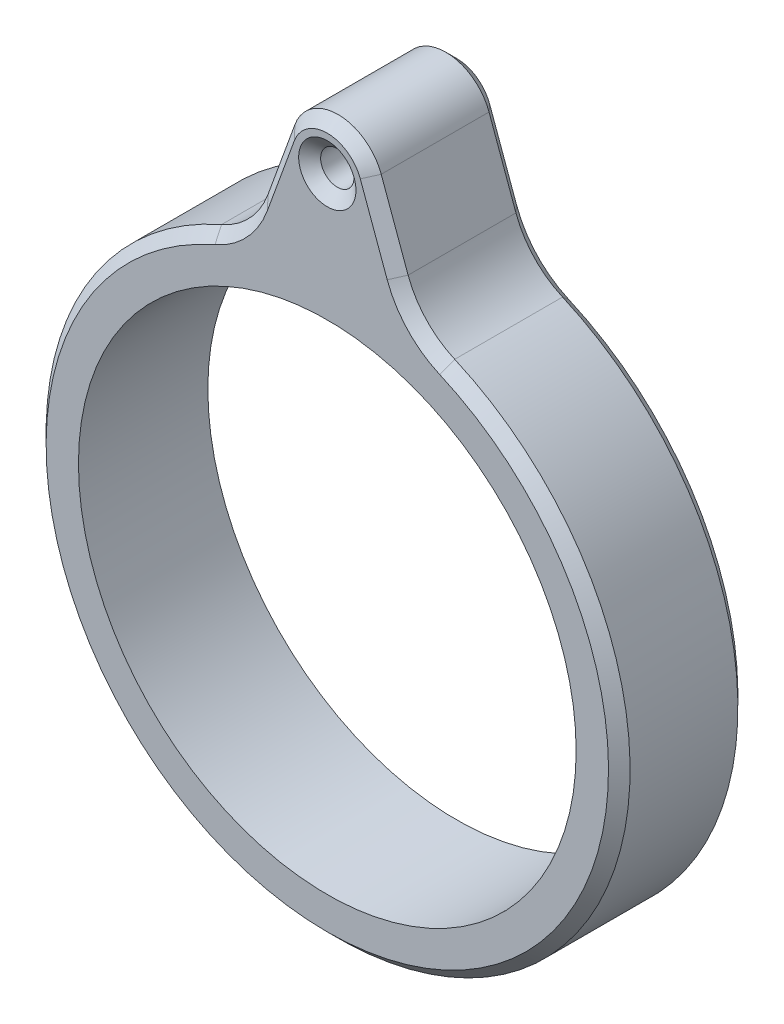
ISO-10303-21;
HEADER;
FILE_DESCRIPTION(('STEP AP214'),'2;1');
FILE_NAME('part.step','',(''),(''),'','','');
FILE_SCHEMA(('AUTOMOTIVE_DESIGN { 1 0 10303 214 1 1 1 1 }'));
ENDSEC;
DATA;
#1=APPLICATION_CONTEXT('core data for automotive mechanical design processes');
#2=APPLICATION_PROTOCOL_DEFINITION('international standard','automotive_design',2000,#1);
#3=PRODUCT_CONTEXT('',#1,'mechanical');
#4=PRODUCT('Part','Part','',(#3));
#5=PRODUCT_RELATED_PRODUCT_CATEGORY('part','',(#4));
#6=PRODUCT_DEFINITION_FORMATION('','',#4);
#7=PRODUCT_DEFINITION_CONTEXT('part definition',#1,'design');
#8=PRODUCT_DEFINITION('design','',#6,#7);
#9=PRODUCT_DEFINITION_SHAPE('','',#8);
#10=(LENGTH_UNIT() NAMED_UNIT(*) SI_UNIT(.MILLI.,.METRE.));
#11=(NAMED_UNIT(*) PLANE_ANGLE_UNIT() SI_UNIT($,.RADIAN.));
#12=(NAMED_UNIT(*) SI_UNIT($,.STERADIAN.) SOLID_ANGLE_UNIT());
#13=UNCERTAINTY_MEASURE_WITH_UNIT(LENGTH_MEASURE(1.E-05),#10,'distance_accuracy_value','');
#14=(GEOMETRIC_REPRESENTATION_CONTEXT(3) GLOBAL_UNCERTAINTY_ASSIGNED_CONTEXT((#13)) GLOBAL_UNIT_ASSIGNED_CONTEXT((#10,
#11,#12)) REPRESENTATION_CONTEXT('',''));
#15=CARTESIAN_POINT('',(0.,0.,0.));
#16=DIRECTION('',(0.,0.,1.));
#17=DIRECTION('',(1.,0.,0.));
#18=AXIS2_PLACEMENT_3D('',#15,#16,#17);
#19=CARTESIAN_POINT('',(0.,0.,19.05));
#20=DIRECTION('',(0.,0.,1.));
#21=DIRECTION('',(1.,0.,0.));
#22=AXIS2_PLACEMENT_3D('',#19,#20,#21);
#23=PLANE('',#22);
#24=CARTESIAN_POINT('',(0.,55.281971144778,19.05));
#25=DIRECTION('',(0.,0.,1.));
#26=DIRECTION('',(1.,0.,0.));
#27=AXIS2_PLACEMENT_3D('',#24,#25,#26);
#28=CIRCLE('',#27,4.2164);
#29=CARTESIAN_POINT('',(4.2164,55.281971144778,19.05));
#30=VERTEX_POINT('',#29);
#31=EDGE_CURVE('E542',#30,#30,#28,.T.);
#32=ORIENTED_EDGE('',*,*,#31,.F.);
#33=EDGE_LOOP('',(#32));
#34=FACE_BOUND('',#33,.T.);
#35=DIRECTION('',(-0.342020143325663,0.939692620785911,0.));
#36=VECTOR('',#35,1.);
#37=CARTESIAN_POINT('',(22.6255210099582,8.2350161823892,19.05));
#38=LINE('',#37,#36);
#39=CARTESIAN_POINT('',(8.81942001328237,46.1669669214668,19.05));
#40=VERTEX_POINT('',#39);
#41=CARTESIAN_POINT('',(4.85823796450243,57.0502251548388,19.05));
#42=VERTEX_POINT('',#41);
#43=EDGE_CURVE('E60',#40,#42,#38,.T.);
#44=ORIENTED_EDGE('',*,*,#43,.T.);
#45=CARTESIAN_POINT('',(0.,55.281971144778,19.05));
#46=DIRECTION('',(0.,0.,1.));
#47=DIRECTION('',(1.,0.,0.));
#48=AXIS2_PLACEMENT_3D('',#45,#46,#47);
#49=CIRCLE('',#48,5.1700288552221);
#50=CARTESIAN_POINT('',(-4.85823796450243,57.0502251548388,19.05));
#51=VERTEX_POINT('',#50);
#52=EDGE_CURVE('E11',#42,#51,#49,.T.);
#53=ORIENTED_EDGE('',*,*,#52,.T.);
#54=DIRECTION('',(-0.342020143325663,-0.939692620785911,0.));
#55=VECTOR('',#54,1.);
#56=CARTESIAN_POINT('',(-22.6255210099582,8.23501618238917,19.05));
#57=LINE('',#56,#55);
#58=CARTESIAN_POINT('',(-8.81942001328235,46.1669669214668,19.05));
#59=VERTEX_POINT('',#58);
#60=EDGE_CURVE('E45',#51,#59,#57,.T.);
#61=ORIENTED_EDGE('',*,*,#60,.T.);
#62=CARTESIAN_POINT('',(-22.245278332761,51.0535797192322,19.05));
#63=DIRECTION('',(0.,0.,1.));
#64=DIRECTION('',(1.,0.,0.));
#65=AXIS2_PLACEMENT_3D('',#62,#63,#64);
#66=CIRCLE('',#65,14.2874999999999);
#67=CARTESIAN_POINT('',(-16.5381088631245,37.9554549337964,19.05));
#68=VERTEX_POINT('',#67);
#69=EDGE_CURVE('E204',#59,#68,#66,.F.);
#70=ORIENTED_EDGE('',*,*,#69,.T.);
#71=CARTESIAN_POINT('',(0.,0.,19.05));
#72=DIRECTION('',(0.,0.,1.));
#73=DIRECTION('',(1.,0.,0.));
#74=AXIS2_PLACEMENT_3D('',#71,#72,#73);
#75=CIRCLE('',#74,41.4020000000001);
#76=CARTESIAN_POINT('',(16.5381088631245,37.9554549337964,19.05));
#77=VERTEX_POINT('',#76);
#78=EDGE_CURVE('E200',#68,#77,#75,.T.);
#79=ORIENTED_EDGE('',*,*,#78,.T.);
#80=CARTESIAN_POINT('',(22.245278332761,51.0535797192321,19.05));
#81=DIRECTION('',(0.,0.,1.));
#82=DIRECTION('',(1.,0.,0.));
#83=AXIS2_PLACEMENT_3D('',#80,#81,#82);
#84=CIRCLE('',#83,14.2874999999999);
#85=EDGE_CURVE('E202',#77,#40,#84,.F.);
#86=ORIENTED_EDGE('',*,*,#85,.T.);
#87=EDGE_LOOP('',(#44,#53,#61,#70,#79,#86));
#88=FACE_BOUND('',#87,.T.);
#89=CARTESIAN_POINT('',(0.,0.,19.05));
#90=DIRECTION('',(0.,0.,1.));
#91=DIRECTION('',(1.,0.,0.));
#92=AXIS2_PLACEMENT_3D('',#89,#90,#91);
#93=CIRCLE('',#92,36.6395);
#94=CARTESIAN_POINT('',(-36.6395,0.,19.05));
#95=VERTEX_POINT('',#94);
#96=EDGE_CURVE('E258',#95,#95,#93,.T.);
#97=ORIENTED_EDGE('',*,*,#96,.F.);
#98=EDGE_LOOP('',(#97));
#99=FACE_BOUND('',#98,.T.);
#100=ADVANCED_FACE('F35',(#34,#88,#99),#23,.T.);
#101=CARTESIAN_POINT('',(0.,0.,0.));
#102=DIRECTION('',(0.,0.,1.));
#103=DIRECTION('',(1.,0.,0.));
#104=AXIS2_PLACEMENT_3D('',#101,#102,#103);
#105=PLANE('',#104);
#106=CARTESIAN_POINT('',(0.,55.281971144778,0.));
#107=DIRECTION('',(0.,0.,1.));
#108=DIRECTION('',(1.,0.,0.));
#109=AXIS2_PLACEMENT_3D('',#106,#107,#108);
#110=CIRCLE('',#109,2.45744999999999);
#111=CARTESIAN_POINT('',(2.45744999999999,55.281971144778,0.));
#112=VERTEX_POINT('',#111);
#113=EDGE_CURVE('E221',#112,#112,#110,.T.);
#114=ORIENTED_EDGE('',*,*,#113,.T.);
#115=EDGE_LOOP('',(#114));
#116=FACE_BOUND('',#115,.T.);
#117=DIRECTION('',(0.342020143325663,0.939692620785911,0.));
#118=VECTOR('',#117,1.);
#119=CARTESIAN_POINT('',(-4.85823796450233,57.0502251548388,0.));
#120=LINE('',#119,#118);
#121=CARTESIAN_POINT('',(-8.81942001328225,46.1669669214668,0.));
#122=VERTEX_POINT('',#121);
#123=CARTESIAN_POINT('',(-4.85823796450233,57.0502251548388,0.));
#124=VERTEX_POINT('',#123);
#125=EDGE_CURVE('E180',#122,#124,#120,.T.);
#126=ORIENTED_EDGE('',*,*,#125,.T.);
#127=CARTESIAN_POINT('',(0.,55.281971144778,0.));
#128=DIRECTION('',(0.,0.,1.));
#129=DIRECTION('',(1.,0.,0.));
#130=AXIS2_PLACEMENT_3D('',#127,#128,#129);
#131=CIRCLE('',#130,5.17002885522199);
#132=CARTESIAN_POINT('',(4.85823796450233,57.0502251548388,0.));
#133=VERTEX_POINT('',#132);
#134=EDGE_CURVE('E182',#124,#133,#131,.F.);
#135=ORIENTED_EDGE('',*,*,#134,.T.);
#136=DIRECTION('',(0.342020143325663,-0.939692620785911,0.));
#137=VECTOR('',#136,1.);
#138=CARTESIAN_POINT('',(8.81942001328227,46.1669669214667,0.));
#139=LINE('',#138,#137);
#140=CARTESIAN_POINT('',(8.81942001328227,46.1669669214667,0.));
#141=VERTEX_POINT('',#140);
#142=EDGE_CURVE('E158',#133,#141,#139,.T.);
#143=ORIENTED_EDGE('',*,*,#142,.T.);
#144=CARTESIAN_POINT('',(22.245278332761,51.0535797192321,0.));
#145=DIRECTION('',(0.,0.,1.));
#146=DIRECTION('',(1.,0.,0.));
#147=AXIS2_PLACEMENT_3D('',#144,#145,#146);
#148=CIRCLE('',#147,14.2875);
#149=CARTESIAN_POINT('',(16.5381088631245,37.9554549337963,0.));
#150=VERTEX_POINT('',#149);
#151=EDGE_CURVE('E170',#141,#150,#148,.T.);
#152=ORIENTED_EDGE('',*,*,#151,.T.);
#153=CARTESIAN_POINT('',(0.,0.,0.));
#154=DIRECTION('',(0.,0.,1.));
#155=DIRECTION('',(1.,0.,0.));
#156=AXIS2_PLACEMENT_3D('',#153,#154,#155);
#157=CIRCLE('',#156,41.402);
#158=CARTESIAN_POINT('',(-16.5381088631245,37.9554549337963,0.));
#159=VERTEX_POINT('',#158);
#160=EDGE_CURVE('E168',#150,#159,#157,.F.);
#161=ORIENTED_EDGE('',*,*,#160,.T.);
#162=CARTESIAN_POINT('',(-22.245278332761,51.0535797192322,0.));
#163=DIRECTION('',(0.,0.,1.));
#164=DIRECTION('',(1.,0.,0.));
#165=AXIS2_PLACEMENT_3D('',#162,#163,#164);
#166=CIRCLE('',#165,14.2875);
#167=EDGE_CURVE('E177',#159,#122,#166,.T.);
#168=ORIENTED_EDGE('',*,*,#167,.T.);
#169=EDGE_LOOP('',(#126,#135,#143,#152,#161,#168));
#170=FACE_BOUND('',#169,.T.);
#171=CARTESIAN_POINT('',(0.,0.,0.));
#172=DIRECTION('',(0.,0.,1.));
#173=DIRECTION('',(1.,0.,0.));
#174=AXIS2_PLACEMENT_3D('',#171,#172,#173);
#175=CIRCLE('',#174,36.6395);
#176=CARTESIAN_POINT('',(-36.6395,0.,0.));
#177=VERTEX_POINT('',#176);
#178=EDGE_CURVE('E152',#177,#177,#175,.T.);
#179=ORIENTED_EDGE('',*,*,#178,.T.);
#180=EDGE_LOOP('',(#179));
#181=FACE_BOUND('',#180,.T.);
#182=ADVANCED_FACE('F286',(#116,#170,#181),#105,.F.);
#183=CARTESIAN_POINT('',(0.,0.,19.05));
#184=DIRECTION('',(0.,0.,-1.));
#185=DIRECTION('',(-1.,0.,0.));
#186=AXIS2_PLACEMENT_3D('',#183,#184,#185);
#187=CYLINDRICAL_SURFACE('',#186,42.9895);
#188=DIRECTION('',(0.,0.,-1.));
#189=VECTOR('',#188,1.);
#190=CARTESIAN_POINT('',(-17.1722388041952,39.4108021321781,19.05));
#191=LINE('',#190,#189);
#192=CARTESIAN_POINT('',(-17.1722388041952,39.4108021321781,17.4625000000001));
#193=VERTEX_POINT('',#192);
#194=CARTESIAN_POINT('',(-17.1722388041952,39.4108021321781,1.58750000000003));
#195=VERTEX_POINT('',#194);
#196=EDGE_CURVE('E249',#193,#195,#191,.T.);
#197=ORIENTED_EDGE('',*,*,#196,.T.);
#198=CARTESIAN_POINT('',(0.,0.,1.58750000000003));
#199=DIRECTION('',(0.,0.,1.));
#200=DIRECTION('',(1.,0.,0.));
#201=AXIS2_PLACEMENT_3D('',#198,#199,#200);
#202=CIRCLE('',#201,42.9895);
#203=CARTESIAN_POINT('',(17.1722388041952,39.410802132178,1.58750000000003));
#204=VERTEX_POINT('',#203);
#205=EDGE_CURVE('E198',#195,#204,#202,.T.);
#206=ORIENTED_EDGE('',*,*,#205,.T.);
#207=DIRECTION('',(0.,0.,-1.));
#208=VECTOR('',#207,1.);
#209=CARTESIAN_POINT('',(17.1722388041952,39.410802132178,19.05));
#210=LINE('',#209,#208);
#211=CARTESIAN_POINT('',(17.1722388041952,39.410802132178,17.4625000000001));
#212=VERTEX_POINT('',#211);
#213=EDGE_CURVE('E252',#204,#212,#210,.F.);
#214=ORIENTED_EDGE('',*,*,#213,.T.);
#215=CARTESIAN_POINT('',(0.,0.,17.4625000000001));
#216=DIRECTION('',(0.,0.,1.));
#217=DIRECTION('',(1.,0.,0.));
#218=AXIS2_PLACEMENT_3D('',#215,#216,#217);
#219=CIRCLE('',#218,42.9895);
#220=EDGE_CURVE('E196',#212,#193,#219,.F.);
#221=ORIENTED_EDGE('',*,*,#220,.T.);
#222=EDGE_LOOP('',(#197,#206,#214,#221));
#223=FACE_BOUND('',#222,.T.);
#224=ADVANCED_FACE('F248',(#223),#187,.T.);
#225=CARTESIAN_POINT('',(0.,0.,19.05));
#226=DIRECTION('',(0.,0.,-1.));
#227=DIRECTION('',(-1.,0.,0.));
#228=AXIS2_PLACEMENT_3D('',#225,#226,#227);
#229=CYLINDRICAL_SURFACE('',#228,36.6395);
#230=CARTESIAN_POINT('',(-36.6395,0.,19.05));
#231=CARTESIAN_POINT('',(-36.6395,0.,18.8515625));
#232=CARTESIAN_POINT('',(-36.6395,0.,18.653125));
#233=CARTESIAN_POINT('',(-36.6395,0.,18.25625));
#234=CARTESIAN_POINT('',(-36.6395,0.,18.0578125));
#235=CARTESIAN_POINT('',(-36.6395,0.,17.6609375));
#236=CARTESIAN_POINT('',(-36.6395,0.,17.4625));
#237=CARTESIAN_POINT('',(-36.6395,0.,17.065625));
#238=CARTESIAN_POINT('',(-36.6395,0.,16.8671875));
#239=CARTESIAN_POINT('',(-36.6395,0.,16.4703125));
#240=CARTESIAN_POINT('',(-36.6395,0.,16.271875));
#241=CARTESIAN_POINT('',(-36.6395,0.,15.875));
#242=CARTESIAN_POINT('',(-36.6395,0.,15.6765625));
#243=CARTESIAN_POINT('',(-36.6395,0.,15.2796875));
#244=CARTESIAN_POINT('',(-36.6395,0.,15.08125));
#245=CARTESIAN_POINT('',(-36.6395,0.,14.684375));
#246=CARTESIAN_POINT('',(-36.6395,0.,14.4859375));
#247=CARTESIAN_POINT('',(-36.6395,0.,14.0890625));
#248=CARTESIAN_POINT('',(-36.6395,0.,13.890625));
#249=CARTESIAN_POINT('',(-36.6395,0.,13.49375));
#250=CARTESIAN_POINT('',(-36.6395,0.,13.2953125));
#251=CARTESIAN_POINT('',(-36.6395,0.,12.8984375));
#252=CARTESIAN_POINT('',(-36.6395,0.,12.7));
#253=CARTESIAN_POINT('',(-36.6395,0.,12.303125));
#254=CARTESIAN_POINT('',(-36.6395,0.,12.1046875));
#255=CARTESIAN_POINT('',(-36.6395,0.,11.7078125));
#256=CARTESIAN_POINT('',(-36.6395,0.,11.509375));
#257=CARTESIAN_POINT('',(-36.6395,0.,11.1125));
#258=CARTESIAN_POINT('',(-36.6395,0.,10.9140625));
#259=CARTESIAN_POINT('',(-36.6395,0.,10.5171875));
#260=CARTESIAN_POINT('',(-36.6395,0.,10.31875));
#261=CARTESIAN_POINT('',(-36.6395,0.,9.921875));
#262=CARTESIAN_POINT('',(-36.6395,0.,9.7234375));
#263=CARTESIAN_POINT('',(-36.6395,0.,9.3265625));
#264=CARTESIAN_POINT('',(-36.6395,0.,9.128125));
#265=CARTESIAN_POINT('',(-36.6395,0.,8.73125));
#266=CARTESIAN_POINT('',(-36.6395,0.,8.5328125));
#267=CARTESIAN_POINT('',(-36.6395,0.,8.1359375));
#268=CARTESIAN_POINT('',(-36.6395,0.,7.9375));
#269=CARTESIAN_POINT('',(-36.6395,0.,7.540625));
#270=CARTESIAN_POINT('',(-36.6395,0.,7.3421875));
#271=CARTESIAN_POINT('',(-36.6395,0.,6.9453125));
#272=CARTESIAN_POINT('',(-36.6395,0.,6.746875));
#273=CARTESIAN_POINT('',(-36.6395,0.,6.35));
#274=CARTESIAN_POINT('',(-36.6395,0.,6.1515625));
#275=CARTESIAN_POINT('',(-36.6395,0.,5.7546875));
#276=CARTESIAN_POINT('',(-36.6395,0.,5.55625));
#277=CARTESIAN_POINT('',(-36.6395,0.,5.159375));
#278=CARTESIAN_POINT('',(-36.6395,0.,4.9609375));
#279=CARTESIAN_POINT('',(-36.6395,0.,4.5640625));
#280=CARTESIAN_POINT('',(-36.6395,0.,4.365625));
#281=CARTESIAN_POINT('',(-36.6395,0.,3.96875));
#282=CARTESIAN_POINT('',(-36.6395,0.,3.7703125));
#283=CARTESIAN_POINT('',(-36.6395,0.,3.3734375));
#284=CARTESIAN_POINT('',(-36.6395,0.,3.175));
#285=CARTESIAN_POINT('',(-36.6395,0.,2.778125));
#286=CARTESIAN_POINT('',(-36.6395,0.,2.5796875));
#287=CARTESIAN_POINT('',(-36.6395,0.,2.1828125));
#288=CARTESIAN_POINT('',(-36.6395,0.,1.984375));
#289=CARTESIAN_POINT('',(-36.6395,0.,1.5875));
#290=CARTESIAN_POINT('',(-36.6395,0.,1.3890625));
#291=CARTESIAN_POINT('',(-36.6395,0.,0.992187500000001));
#292=CARTESIAN_POINT('',(-36.6395,0.,0.793750000000001));
#293=CARTESIAN_POINT('',(-36.6395,0.,0.396875));
#294=CARTESIAN_POINT('',(-36.6395,0.,0.1984375));
#295=CARTESIAN_POINT('',(-36.6395,0.,0.));
#296=B_SPLINE_CURVE_WITH_KNOTS('',3,(#230,#231,#232,#233,#234,#235,#236,#237,#238,#239,#240,
#241,#242,#243,#244,#245,#246,#247,#248,#249,#250,#251,#252,#253,#254,#255,#256,#257,#258,#259,
#260,#261,#262,#263,#264,#265,#266,#267,#268,#269,#270,#271,#272,#273,#274,#275,#276,#277,#278,
#279,#280,#281,#282,#283,#284,#285,#286,#287,#288,#289,#290,#291,#292,#293,#294,#295),
.UNSPECIFIED.,.F.,.F.,(4,2,2,2,2,2,2,2,2,2,2,2,2,2,2,2,2,2,2,2,2,2,2,2,2,2,2,2,2,2,2,2,4),(0.,
0.595312499999997,1.190625,1.7859375,2.38125,2.9765625,3.571875,4.1671875,4.7625,5.3578125,
5.953125,6.5484375,7.14375,7.7390625,8.334375,8.9296875,9.525,10.1203125,10.715625,11.3109375,
11.90625,12.5015625,13.096875,13.6921875,14.2875,14.8828125,15.478125,16.0734375,16.66875,
17.2640625,17.859375,18.4546875,19.05),.UNSPECIFIED.);
#297=EDGE_CURVE('BSEAM317',#95,#177,#296,.T.);
#298=ORIENTED_EDGE('',*,*,#96,.T.);
#299=ORIENTED_EDGE('',*,*,#178,.F.);
#300=ORIENTED_EDGE('',*,*,#297,.T.);
#301=ORIENTED_EDGE('',*,*,#297,.F.);
#302=EDGE_LOOP('',(#298,#300,#299,#301));
#303=FACE_BOUND('',#302,.T.);
#304=ADVANCED_FACE('F317',(#303),#229,.F.);
#305=CARTESIAN_POINT('',(0.,55.281971144778,0.));
#306=DIRECTION('',(0.,0.,1.));
#307=DIRECTION('',(1.,0.,0.));
#308=AXIS2_PLACEMENT_3D('',#305,#306,#307);
#309=CYLINDRICAL_SURFACE('',#308,6.75752885522203);
#310=DIRECTION('',(0.,0.,1.));
#311=VECTOR('',#310,1.);
#312=CARTESIAN_POINT('',(6.35,57.5931821323683,0.));
#313=LINE('',#312,#311);
#314=CARTESIAN_POINT('',(6.35,57.5931821323683,1.58750000000003));
#315=VERTEX_POINT('',#314);
#316=CARTESIAN_POINT('',(6.35,57.5931821323683,17.4625000000001));
#317=VERTEX_POINT('',#316);
#318=EDGE_CURVE('E133',#315,#317,#313,.T.);
#319=ORIENTED_EDGE('',*,*,#318,.F.);
#320=CARTESIAN_POINT('',(0.,55.281971144778,1.58750000000003));
#321=DIRECTION('',(0.,0.,1.));
#322=DIRECTION('',(1.,0.,0.));
#323=AXIS2_PLACEMENT_3D('',#320,#321,#322);
#324=CIRCLE('',#323,6.75752885522203);
#325=CARTESIAN_POINT('',(-6.35,57.5931821323683,1.58750000000003));
#326=VERTEX_POINT('',#325);
#327=EDGE_CURVE('E149',#315,#326,#324,.T.);
#328=ORIENTED_EDGE('',*,*,#327,.T.);
#329=DIRECTION('',(0.,0.,1.));
#330=VECTOR('',#329,1.);
#331=CARTESIAN_POINT('',(-6.35,57.5931821323683,0.));
#332=LINE('',#331,#330);
#333=CARTESIAN_POINT('',(-6.35,57.5931821323683,17.4625000000001));
#334=VERTEX_POINT('',#333);
#335=EDGE_CURVE('E153',#326,#334,#332,.T.);
#336=ORIENTED_EDGE('',*,*,#335,.T.);
#337=CARTESIAN_POINT('',(0.,55.281971144778,17.4625000000001));
#338=DIRECTION('',(0.,0.,1.));
#339=DIRECTION('',(1.,0.,0.));
#340=AXIS2_PLACEMENT_3D('',#337,#338,#339);
#341=CIRCLE('',#340,6.75752885522203);
#342=EDGE_CURVE('E151',#334,#317,#341,.F.);
#343=ORIENTED_EDGE('',*,*,#342,.T.);
#344=EDGE_LOOP('',(#319,#328,#336,#343));
#345=FACE_BOUND('',#344,.T.);
#346=ADVANCED_FACE('F146',(#345),#309,.T.);
#347=CARTESIAN_POINT('',(6.35,57.5931821323683,0.));
#348=DIRECTION('',(0.939692620785911,0.342020143325663,0.));
#349=DIRECTION('',(-0.342020143325663,0.939692620785911,0.));
#350=AXIS2_PLACEMENT_3D('',#347,#348,#349);
#351=PLANE('',#350);
#352=DIRECTION('',(0.,0.,-1.));
#353=VECTOR('',#352,1.);
#354=CARTESIAN_POINT('',(10.3111820487799,46.7099238989962,0.));
#355=LINE('',#354,#353);
#356=CARTESIAN_POINT('',(10.3111820487799,46.7099238989962,17.4625000000001));
#357=VERTEX_POINT('',#356);
#358=CARTESIAN_POINT('',(10.3111820487799,46.7099238989962,1.58750000000003));
#359=VERTEX_POINT('',#358);
#360=EDGE_CURVE('E135',#357,#359,#355,.T.);
#361=ORIENTED_EDGE('',*,*,#360,.T.);
#362=DIRECTION('',(-0.342020143325663,0.939692620785911,0.));
#363=VECTOR('',#362,1.);
#364=CARTESIAN_POINT('',(6.35,57.5931821323683,1.58750000000003));
#365=LINE('',#364,#363);
#366=EDGE_CURVE('E130',#359,#315,#365,.T.);
#367=ORIENTED_EDGE('',*,*,#366,.T.);
#368=ORIENTED_EDGE('',*,*,#318,.T.);
#369=DIRECTION('',(0.342020143325663,-0.939692620785911,0.));
#370=VECTOR('',#369,1.);
#371=CARTESIAN_POINT('',(6.35,57.5931821323683,17.4625000000001));
#372=LINE('',#371,#370);
#373=EDGE_CURVE('E141',#317,#357,#372,.T.);
#374=ORIENTED_EDGE('',*,*,#373,.T.);
#375=EDGE_LOOP('',(#361,#367,#368,#374));
#376=FACE_BOUND('',#375,.T.);
#377=ADVANCED_FACE('F132',(#376),#351,.T.);
#378=CARTESIAN_POINT('',(-6.35,57.5931821323683,0.));
#379=DIRECTION('',(-0.939692620785911,0.342020143325663,0.));
#380=DIRECTION('',(-0.342020143325663,-0.939692620785911,0.));
#381=AXIS2_PLACEMENT_3D('',#378,#379,#380);
#382=PLANE('',#381);
#383=ORIENTED_EDGE('',*,*,#335,.F.);
#384=DIRECTION('',(-0.342020143325663,-0.939692620785911,0.));
#385=VECTOR('',#384,1.);
#386=CARTESIAN_POINT('',(-10.3111820487799,46.7099238989963,1.58750000000003));
#387=LINE('',#386,#385);
#388=CARTESIAN_POINT('',(-10.3111820487799,46.7099238989963,1.58750000000003));
#389=VERTEX_POINT('',#388);
#390=EDGE_CURVE('E186',#326,#389,#387,.T.);
#391=ORIENTED_EDGE('',*,*,#390,.T.);
#392=DIRECTION('',(0.,0.,-1.));
#393=VECTOR('',#392,1.);
#394=CARTESIAN_POINT('',(-10.3111820487799,46.7099238989963,0.));
#395=LINE('',#394,#393);
#396=CARTESIAN_POINT('',(-10.3111820487799,46.7099238989963,17.4625000000001));
#397=VERTEX_POINT('',#396);
#398=EDGE_CURVE('E172',#389,#397,#395,.F.);
#399=ORIENTED_EDGE('',*,*,#398,.T.);
#400=DIRECTION('',(0.342020143325663,0.939692620785911,0.));
#401=VECTOR('',#400,1.);
#402=CARTESIAN_POINT('',(-6.35,57.5931821323683,17.4625000000001));
#403=LINE('',#402,#401);
#404=EDGE_CURVE('E184',#397,#334,#403,.T.);
#405=ORIENTED_EDGE('',*,*,#404,.T.);
#406=EDGE_LOOP('',(#383,#391,#399,#405));
#407=FACE_BOUND('',#406,.T.);
#408=ADVANCED_FACE('F267',(#407),#382,.T.);
#409=CARTESIAN_POINT('',(22.245278332761,51.0535797192321,19.05));
#410=DIRECTION('',(0.,0.,-1.));
#411=DIRECTION('',(-1.,0.,0.));
#412=AXIS2_PLACEMENT_3D('',#409,#410,#411);
#413=CYLINDRICAL_SURFACE('',#412,12.7);
#414=ORIENTED_EDGE('',*,*,#213,.F.);
#415=CARTESIAN_POINT('',(22.245278332761,51.0535797192321,1.58750000000003));
#416=DIRECTION('',(0.,0.,1.));
#417=DIRECTION('',(1.,0.,0.));
#418=AXIS2_PLACEMENT_3D('',#415,#416,#417);
#419=CIRCLE('',#418,12.7);
#420=EDGE_CURVE('E194',#204,#359,#419,.F.);
#421=ORIENTED_EDGE('',*,*,#420,.T.);
#422=ORIENTED_EDGE('',*,*,#360,.F.);
#423=CARTESIAN_POINT('',(22.245278332761,51.0535797192321,17.4625000000001));
#424=DIRECTION('',(0.,0.,1.));
#425=DIRECTION('',(1.,0.,0.));
#426=AXIS2_PLACEMENT_3D('',#423,#424,#425);
#427=CIRCLE('',#426,12.7);
#428=EDGE_CURVE('E192',#357,#212,#427,.T.);
#429=ORIENTED_EDGE('',*,*,#428,.T.);
#430=EDGE_LOOP('',(#414,#421,#422,#429));
#431=FACE_BOUND('',#430,.T.);
#432=ADVANCED_FACE('F278',(#431),#413,.F.);
#433=CARTESIAN_POINT('',(-22.245278332761,51.0535797192322,19.05));
#434=DIRECTION('',(0.,0.,-1.));
#435=DIRECTION('',(-1.,0.,0.));
#436=AXIS2_PLACEMENT_3D('',#433,#434,#435);
#437=CYLINDRICAL_SURFACE('',#436,12.7);
#438=ORIENTED_EDGE('',*,*,#398,.F.);
#439=CARTESIAN_POINT('',(-22.245278332761,51.0535797192322,1.58750000000003));
#440=DIRECTION('',(0.,0.,1.));
#441=DIRECTION('',(1.,0.,0.));
#442=AXIS2_PLACEMENT_3D('',#439,#440,#441);
#443=CIRCLE('',#442,12.7);
#444=EDGE_CURVE('E190',#389,#195,#443,.F.);
#445=ORIENTED_EDGE('',*,*,#444,.T.);
#446=ORIENTED_EDGE('',*,*,#196,.F.);
#447=CARTESIAN_POINT('',(-22.245278332761,51.0535797192322,17.4625000000001));
#448=DIRECTION('',(0.,0.,1.));
#449=DIRECTION('',(1.,0.,0.));
#450=AXIS2_PLACEMENT_3D('',#447,#448,#449);
#451=CIRCLE('',#450,12.7);
#452=EDGE_CURVE('E140',#193,#397,#451,.T.);
#453=ORIENTED_EDGE('',*,*,#452,.T.);
#454=EDGE_LOOP('',(#438,#445,#446,#453));
#455=FACE_BOUND('',#454,.T.);
#456=ADVANCED_FACE('F255',(#455),#437,.F.);
#457=CARTESIAN_POINT('',(0.,0.,1.58750000000003));
#458=DIRECTION('',(0.,0.,1.));
#459=DIRECTION('',(1.,0.,0.));
#460=AXIS2_PLACEMENT_3D('',#457,#458,#459);
#461=CONICAL_SURFACE('',#460,42.9895,0.78539816339745);
#462=DIRECTION('',(-0.282455169439077,0.648243069578954,0.707106781186546));
#463=VECTOR('',#462,1.);
#464=CARTESIAN_POINT('',(-16.5381088631245,37.9554549337963,0.));
#465=LINE('',#464,#463);
#466=EDGE_CURVE('E213',#159,#195,#465,.T.);
#467=ORIENTED_EDGE('',*,*,#466,.F.);
#468=ORIENTED_EDGE('',*,*,#160,.F.);
#469=DIRECTION('',(-0.282455169439077,-0.648243069578954,-0.707106781186546));
#470=VECTOR('',#469,1.);
#471=CARTESIAN_POINT('',(17.1722388041952,39.4108021321781,1.58750000000003));
#472=LINE('',#471,#470);
#473=EDGE_CURVE('E216',#204,#150,#472,.T.);
#474=ORIENTED_EDGE('',*,*,#473,.F.);
#475=ORIENTED_EDGE('',*,*,#205,.F.);
#476=EDGE_LOOP('',(#467,#468,#474,#475));
#477=FACE_BOUND('',#476,.T.);
#478=ADVANCED_FACE('F290',(#477),#461,.T.);
#479=CARTESIAN_POINT('',(22.245278332761,51.0535797192321,0.));
#480=DIRECTION('',(0.,0.,-1.));
#481=DIRECTION('',(-1.,0.,0.));
#482=AXIS2_PLACEMENT_3D('',#479,#480,#481);
#483=CONICAL_SURFACE('',#482,14.2875,0.78539816339745);
#484=ORIENTED_EDGE('',*,*,#473,.T.);
#485=ORIENTED_EDGE('',*,*,#151,.F.);
#486=DIRECTION('',(-0.664463024388678,-0.241844762647971,-0.707106781186546));
#487=VECTOR('',#486,1.);
#488=CARTESIAN_POINT('',(10.3111820487799,46.7099238989962,1.58750000000003));
#489=LINE('',#488,#487);
#490=EDGE_CURVE('E211',#359,#141,#489,.T.);
#491=ORIENTED_EDGE('',*,*,#490,.F.);
#492=ORIENTED_EDGE('',*,*,#420,.F.);
#493=EDGE_LOOP('',(#484,#485,#491,#492));
#494=FACE_BOUND('',#493,.T.);
#495=ADVANCED_FACE('F282',(#494),#483,.F.);
#496=CARTESIAN_POINT('',(-22.245278332761,51.0535797192322,0.));
#497=DIRECTION('',(0.,0.,-1.));
#498=DIRECTION('',(-1.,0.,0.));
#499=AXIS2_PLACEMENT_3D('',#496,#497,#498);
#500=CONICAL_SURFACE('',#499,14.2875,0.785398163397451);
#501=ORIENTED_EDGE('',*,*,#466,.T.);
#502=ORIENTED_EDGE('',*,*,#444,.F.);
#503=DIRECTION('',(-0.664463024388679,0.24184476264797,0.707106781186545));
#504=VECTOR('',#503,1.);
#505=CARTESIAN_POINT('',(-8.81942001328225,46.1669669214668,0.));
#506=LINE('',#505,#504);
#507=EDGE_CURVE('E162',#122,#389,#506,.T.);
#508=ORIENTED_EDGE('',*,*,#507,.F.);
#509=ORIENTED_EDGE('',*,*,#167,.F.);
#510=EDGE_LOOP('',(#501,#502,#508,#509));
#511=FACE_BOUND('',#510,.T.);
#512=ADVANCED_FACE('F294',(#511),#500,.F.);
#513=CARTESIAN_POINT('',(6.35,57.5931821323683,1.58750000000003));
#514=DIRECTION('',(0.664463024388675,0.24184476264797,-0.707106781186549));
#515=DIRECTION('',(0.342020143325663,-0.939692620785911,0.));
#516=AXIS2_PLACEMENT_3D('',#513,#514,#515);
#517=PLANE('',#516);
#518=ORIENTED_EDGE('',*,*,#490,.T.);
#519=ORIENTED_EDGE('',*,*,#142,.F.);
#520=DIRECTION('',(-0.664463024388678,-0.241844762647971,-0.707106781186546));
#521=VECTOR('',#520,1.);
#522=CARTESIAN_POINT('',(6.35,57.5931821323683,1.58750000000003));
#523=LINE('',#522,#521);
#524=EDGE_CURVE('E156',#315,#133,#523,.T.);
#525=ORIENTED_EDGE('',*,*,#524,.F.);
#526=ORIENTED_EDGE('',*,*,#366,.F.);
#527=EDGE_LOOP('',(#518,#519,#525,#526));
#528=FACE_BOUND('',#527,.T.);
#529=ADVANCED_FACE('F157',(#528),#517,.T.);
#530=CARTESIAN_POINT('',(-6.35,57.5931821323683,1.58750000000003));
#531=DIRECTION('',(-0.664463024388675,0.24184476264797,-0.707106781186549));
#532=DIRECTION('',(0.342020143325663,0.939692620785911,0.));
#533=AXIS2_PLACEMENT_3D('',#530,#531,#532);
#534=PLANE('',#533);
#535=ORIENTED_EDGE('',*,*,#507,.T.);
#536=ORIENTED_EDGE('',*,*,#390,.F.);
#537=DIRECTION('',(-0.664463024388678,0.241844762647971,0.707106781186546));
#538=VECTOR('',#537,1.);
#539=CARTESIAN_POINT('',(-4.85823796450233,57.0502251548388,0.));
#540=LINE('',#539,#538);
#541=EDGE_CURVE('E163',#124,#326,#540,.T.);
#542=ORIENTED_EDGE('',*,*,#541,.F.);
#543=ORIENTED_EDGE('',*,*,#125,.F.);
#544=EDGE_LOOP('',(#535,#536,#542,#543));
#545=FACE_BOUND('',#544,.T.);
#546=ADVANCED_FACE('F297',(#545),#534,.T.);
#547=CARTESIAN_POINT('',(0.,55.281971144778,1.58750000000003));
#548=DIRECTION('',(0.,0.,1.));
#549=DIRECTION('',(1.,0.,0.));
#550=AXIS2_PLACEMENT_3D('',#547,#548,#549);
#551=CONICAL_SURFACE('',#550,6.75752885522203,0.78539816339745);
#552=ORIENTED_EDGE('',*,*,#524,.T.);
#553=ORIENTED_EDGE('',*,*,#134,.F.);
#554=ORIENTED_EDGE('',*,*,#541,.T.);
#555=ORIENTED_EDGE('',*,*,#327,.F.);
#556=EDGE_LOOP('',(#552,#553,#554,#555));
#557=FACE_BOUND('',#556,.T.);
#558=ADVANCED_FACE('F165',(#557),#551,.T.);
#559=CARTESIAN_POINT('',(0.,0.,19.05));
#560=DIRECTION('',(0.,0.,-1.));
#561=DIRECTION('',(-1.,0.,0.));
#562=AXIS2_PLACEMENT_3D('',#559,#560,#561);
#563=CONICAL_SURFACE('',#562,41.4020000000001,0.78539816339745);
#564=DIRECTION('',(0.282455169439077,-0.648243069578954,0.707106781186546));
#565=VECTOR('',#564,1.);
#566=CARTESIAN_POINT('',(-17.1722388041952,39.4108021321781,17.4625000000001));
#567=LINE('',#566,#565);
#568=EDGE_CURVE('E228',#193,#68,#567,.T.);
#569=ORIENTED_EDGE('',*,*,#568,.F.);
#570=ORIENTED_EDGE('',*,*,#220,.F.);
#571=DIRECTION('',(0.282455169439077,0.648243069578954,-0.707106781186546));
#572=VECTOR('',#571,1.);
#573=CARTESIAN_POINT('',(16.5381088631245,37.9554549337964,19.05));
#574=LINE('',#573,#572);
#575=EDGE_CURVE('E40',#77,#212,#574,.T.);
#576=ORIENTED_EDGE('',*,*,#575,.F.);
#577=ORIENTED_EDGE('',*,*,#78,.F.);
#578=EDGE_LOOP('',(#569,#570,#576,#577));
#579=FACE_BOUND('',#578,.T.);
#580=ADVANCED_FACE('F38',(#579),#563,.T.);
#581=CARTESIAN_POINT('',(22.245278332761,51.0535797192321,19.05));
#582=DIRECTION('',(0.,0.,1.));
#583=DIRECTION('',(1.,0.,0.));
#584=AXIS2_PLACEMENT_3D('',#581,#582,#583);
#585=CONICAL_SURFACE('',#584,14.2874999999999,0.78539816339745);
#586=ORIENTED_EDGE('',*,*,#575,.T.);
#587=ORIENTED_EDGE('',*,*,#428,.F.);
#588=DIRECTION('',(0.664463024388677,0.241844762647971,-0.707106781186547));
#589=VECTOR('',#588,1.);
#590=CARTESIAN_POINT('',(8.81942001328237,46.1669669214668,19.05));
#591=LINE('',#590,#589);
#592=EDGE_CURVE('E226',#40,#357,#591,.T.);
#593=ORIENTED_EDGE('',*,*,#592,.F.);
#594=ORIENTED_EDGE('',*,*,#85,.F.);
#595=EDGE_LOOP('',(#586,#587,#593,#594));
#596=FACE_BOUND('',#595,.T.);
#597=ADVANCED_FACE('F239',(#596),#585,.F.);
#598=CARTESIAN_POINT('',(-22.245278332761,51.0535797192322,19.05));
#599=DIRECTION('',(0.,0.,1.));
#600=DIRECTION('',(1.,0.,0.));
#601=AXIS2_PLACEMENT_3D('',#598,#599,#600);
#602=CONICAL_SURFACE('',#601,14.2874999999999,0.78539816339745);
#603=ORIENTED_EDGE('',*,*,#568,.T.);
#604=ORIENTED_EDGE('',*,*,#69,.F.);
#605=DIRECTION('',(0.664463024388679,-0.241844762647971,0.707106781186545));
#606=VECTOR('',#605,1.);
#607=CARTESIAN_POINT('',(-10.3111820487799,46.7099238989963,17.4625000000001));
#608=LINE('',#607,#606);
#609=EDGE_CURVE('E223',#397,#59,#608,.T.);
#610=ORIENTED_EDGE('',*,*,#609,.F.);
#611=ORIENTED_EDGE('',*,*,#452,.F.);
#612=EDGE_LOOP('',(#603,#604,#610,#611));
#613=FACE_BOUND('',#612,.T.);
#614=ADVANCED_FACE('F269',(#613),#602,.F.);
#615=CARTESIAN_POINT('',(22.6255210099582,8.2350161823892,19.05));
#616=DIRECTION('',(-0.664463024388674,-0.24184476264797,-0.707106781186549));
#617=DIRECTION('',(-0.342020143325663,0.939692620785911,0.));
#618=AXIS2_PLACEMENT_3D('',#615,#616,#617);
#619=PLANE('',#618);
#620=ORIENTED_EDGE('',*,*,#592,.T.);
#621=ORIENTED_EDGE('',*,*,#373,.F.);
#622=DIRECTION('',(0.664463024388678,0.241844762647971,-0.707106781186546));
#623=VECTOR('',#622,1.);
#624=CARTESIAN_POINT('',(4.85823796450243,57.0502251548388,19.05));
#625=LINE('',#624,#623);
#626=EDGE_CURVE('E220',#42,#317,#625,.T.);
#627=ORIENTED_EDGE('',*,*,#626,.F.);
#628=ORIENTED_EDGE('',*,*,#43,.F.);
#629=EDGE_LOOP('',(#620,#621,#627,#628));
#630=FACE_BOUND('',#629,.T.);
#631=ADVANCED_FACE('F276',(#630),#619,.F.);
#632=CARTESIAN_POINT('',(-22.6255210099582,8.23501618238917,19.05));
#633=DIRECTION('',(0.664463024388674,-0.24184476264797,-0.707106781186549));
#634=DIRECTION('',(-0.342020143325663,-0.939692620785911,0.));
#635=AXIS2_PLACEMENT_3D('',#632,#633,#634);
#636=PLANE('',#635);
#637=ORIENTED_EDGE('',*,*,#609,.T.);
#638=ORIENTED_EDGE('',*,*,#60,.F.);
#639=DIRECTION('',(0.664463024388678,-0.241844762647971,0.707106781186546));
#640=VECTOR('',#639,1.);
#641=CARTESIAN_POINT('',(-6.35,57.5931821323683,17.4625000000001));
#642=LINE('',#641,#640);
#643=EDGE_CURVE('E53',#334,#51,#642,.T.);
#644=ORIENTED_EDGE('',*,*,#643,.F.);
#645=ORIENTED_EDGE('',*,*,#404,.F.);
#646=EDGE_LOOP('',(#637,#638,#644,#645));
#647=FACE_BOUND('',#646,.T.);
#648=ADVANCED_FACE('F271',(#647),#636,.F.);
#649=CARTESIAN_POINT('',(0.,55.281971144778,19.05));
#650=DIRECTION('',(0.,0.,-1.));
#651=DIRECTION('',(-1.,0.,0.));
#652=AXIS2_PLACEMENT_3D('',#649,#650,#651);
#653=CONICAL_SURFACE('',#652,5.1700288552221,0.785398163397452);
#654=ORIENTED_EDGE('',*,*,#626,.T.);
#655=ORIENTED_EDGE('',*,*,#342,.F.);
#656=ORIENTED_EDGE('',*,*,#643,.T.);
#657=ORIENTED_EDGE('',*,*,#52,.F.);
#658=EDGE_LOOP('',(#654,#655,#656,#657));
#659=FACE_BOUND('',#658,.T.);
#660=ADVANCED_FACE('F273',(#659),#653,.T.);
#661=CARTESIAN_POINT('',(0.,55.281971144778,19.05));
#662=DIRECTION('',(0.,0.,1.));
#663=DIRECTION('',(1.,0.,0.));
#664=AXIS2_PLACEMENT_3D('',#661,#662,#663);
#665=CYLINDRICAL_SURFACE('',#664,2.45744999999999);
#666=ORIENTED_EDGE('',*,*,#113,.F.);
#667=EDGE_LOOP('',(#666));
#668=FACE_BOUND('',#667,.T.);
#669=CARTESIAN_POINT('',(0.,55.281971144778,17.5740657037407));
#670=DIRECTION('',(0.,0.,1.));
#671=DIRECTION('',(1.,0.,0.));
#672=AXIS2_PLACEMENT_3D('',#669,#670,#671);
#673=CIRCLE('',#672,2.45744999999999);
#674=CARTESIAN_POINT('',(2.45744999999999,55.281971144778,17.5740657037407));
#675=VERTEX_POINT('',#674);
#676=EDGE_CURVE('E540',#675,#675,#673,.T.);
#677=ORIENTED_EDGE('',*,*,#676,.T.);
#678=EDGE_LOOP('',(#677));
#679=FACE_BOUND('',#678,.T.);
#680=ADVANCED_FACE('F354',(#668,#679),#665,.F.);
#681=CARTESIAN_POINT('',(0.,55.281971144778,19.05));
#682=DIRECTION('',(0.,0.,1.));
#683=DIRECTION('',(1.,0.,0.));
#684=AXIS2_PLACEMENT_3D('',#681,#682,#683);
#685=CONICAL_SURFACE('',#684,4.2164,0.872664625997166);
#686=ORIENTED_EDGE('',*,*,#676,.F.);
#687=EDGE_LOOP('',(#686));
#688=FACE_BOUND('',#687,.T.);
#689=ORIENTED_EDGE('',*,*,#31,.T.);
#690=EDGE_LOOP('',(#689));
#691=FACE_BOUND('',#690,.T.);
#692=ADVANCED_FACE('F453',(#688,#691),#685,.F.);
#693=CLOSED_SHELL('',(#100,#182,#224,#304,#346,#377,#408,#432,#456,#478,#495,#512,#529,#546,
#558,#580,#597,#614,#631,#648,#660,#680,#692));
#694=MANIFOLD_SOLID_BREP('B2',#693);
#695=ADVANCED_BREP_SHAPE_REPRESENTATION('',(#18,#694),#14);
#696=SHAPE_DEFINITION_REPRESENTATION(#9,#695);
ENDSEC;
END-ISO-10303-21;
